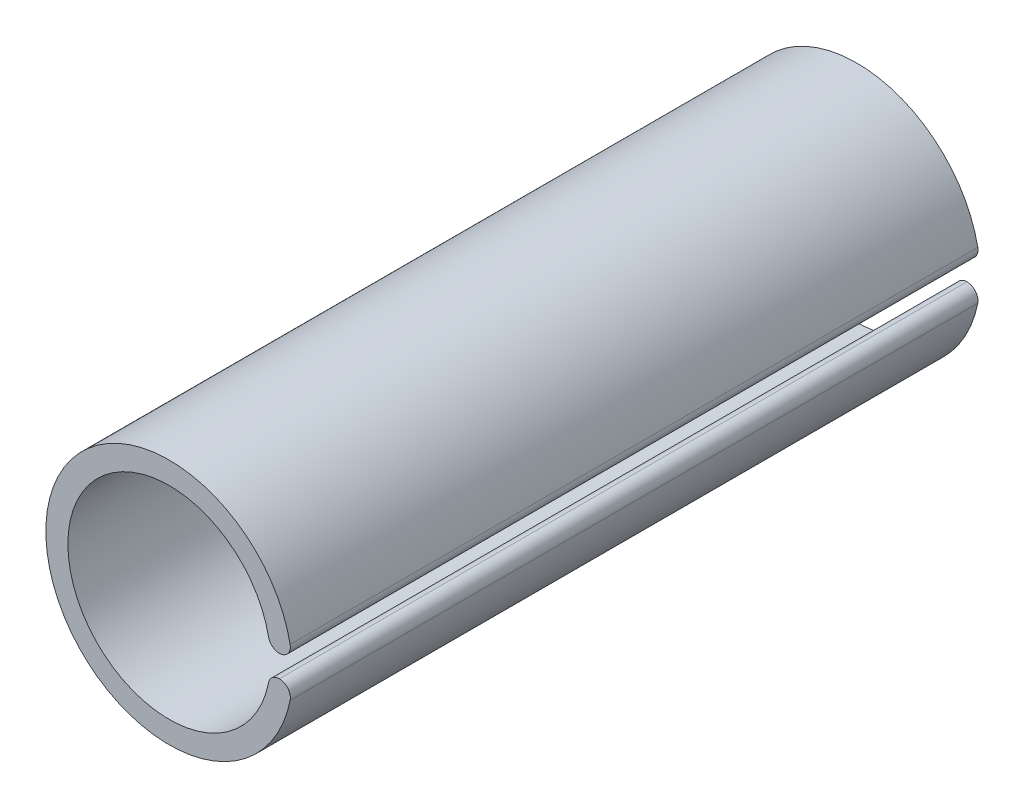
ISO-10303-21;
HEADER;
FILE_DESCRIPTION(('STEP AP214'),'2;1');
FILE_NAME('part.step','',(''),(''),'','','');
FILE_SCHEMA(('AUTOMOTIVE_DESIGN { 1 0 10303 214 1 1 1 1 }'));
ENDSEC;
DATA;
#1=APPLICATION_CONTEXT('core data for automotive mechanical design processes');
#2=APPLICATION_PROTOCOL_DEFINITION('international standard','automotive_design',2000,#1);
#3=PRODUCT_CONTEXT('',#1,'mechanical');
#4=PRODUCT('Part','Part','',(#3));
#5=PRODUCT_RELATED_PRODUCT_CATEGORY('part','',(#4));
#6=PRODUCT_DEFINITION_FORMATION('','',#4);
#7=PRODUCT_DEFINITION_CONTEXT('part definition',#1,'design');
#8=PRODUCT_DEFINITION('design','',#6,#7);
#9=PRODUCT_DEFINITION_SHAPE('','',#8);
#10=(LENGTH_UNIT() NAMED_UNIT(*) SI_UNIT(.MILLI.,.METRE.));
#11=(NAMED_UNIT(*) PLANE_ANGLE_UNIT() SI_UNIT($,.RADIAN.));
#12=(NAMED_UNIT(*) SI_UNIT($,.STERADIAN.) SOLID_ANGLE_UNIT());
#13=UNCERTAINTY_MEASURE_WITH_UNIT(LENGTH_MEASURE(1.E-05),#10,'distance_accuracy_value','');
#14=(GEOMETRIC_REPRESENTATION_CONTEXT(3) GLOBAL_UNCERTAINTY_ASSIGNED_CONTEXT((#13)) GLOBAL_UNIT_ASSIGNED_CONTEXT((#10,
#11,#12)) REPRESENTATION_CONTEXT('',''));
#15=CARTESIAN_POINT('',(0.,0.,0.));
#16=DIRECTION('',(0.,0.,1.));
#17=DIRECTION('',(1.,0.,0.));
#18=AXIS2_PLACEMENT_3D('',#15,#16,#17);
#19=CARTESIAN_POINT('',(0.,0.,31.22));
#20=DIRECTION('',(0.,0.,1.));
#21=DIRECTION('',(1.,0.,0.));
#22=AXIS2_PLACEMENT_3D('',#19,#20,#21);
#23=PLANE('',#22);
#24=CARTESIAN_POINT('',(5.00099990001999,-1.,31.22));
#25=DIRECTION('',(0.,0.,1.));
#26=DIRECTION('',(1.,0.,0.));
#27=AXIS2_PLACEMENT_3D('',#24,#25,#26);
#28=CIRCLE('',#27,0.5);
#29=CARTESIAN_POINT('',(5.49129400786509,-1.09803921568627,31.22));
#30=VERTEX_POINT('',#29);
#31=CARTESIAN_POINT('',(5.00099990001999,-0.5,31.22));
#32=VERTEX_POINT('',#31);
#33=EDGE_CURVE('E57',#30,#32,#28,.T.);
#34=ORIENTED_EDGE('',*,*,#33,.T.);
#35=CARTESIAN_POINT('',(5.00099990001999,-1.,31.22));
#36=DIRECTION('',(0.,0.,1.));
#37=DIRECTION('',(1.,0.,0.));
#38=AXIS2_PLACEMENT_3D('',#35,#36,#37);
#39=CIRCLE('',#38,0.5);
#40=CARTESIAN_POINT('',(4.5107057921749,-0.901960784313725,31.22));
#41=VERTEX_POINT('',#40);
#42=EDGE_CURVE('E102',#32,#41,#39,.T.);
#43=ORIENTED_EDGE('',*,*,#42,.T.);
#44=CARTESIAN_POINT('',(0.,0.,31.22));
#45=DIRECTION('',(0.,0.,1.));
#46=DIRECTION('',(1.,0.,0.));
#47=AXIS2_PLACEMENT_3D('',#44,#45,#46);
#48=CIRCLE('',#47,4.6);
#49=CARTESIAN_POINT('',(4.5107057921749,0.901960784313725,31.22));
#50=VERTEX_POINT('',#49);
#51=EDGE_CURVE('E92',#50,#41,#48,.T.);
#52=ORIENTED_EDGE('',*,*,#51,.F.);
#53=CARTESIAN_POINT('',(5.00099990001999,1.,31.22));
#54=DIRECTION('',(0.,0.,1.));
#55=DIRECTION('',(1.,0.,0.));
#56=AXIS2_PLACEMENT_3D('',#53,#54,#55);
#57=CIRCLE('',#56,0.5);
#58=CARTESIAN_POINT('',(5.00099990001999,0.5,31.22));
#59=VERTEX_POINT('',#58);
#60=EDGE_CURVE('E50',#50,#59,#57,.T.);
#61=ORIENTED_EDGE('',*,*,#60,.T.);
#62=CARTESIAN_POINT('',(5.00099990001999,1.,31.22));
#63=DIRECTION('',(0.,0.,1.));
#64=DIRECTION('',(1.,0.,0.));
#65=AXIS2_PLACEMENT_3D('',#62,#63,#64);
#66=CIRCLE('',#65,0.5);
#67=CARTESIAN_POINT('',(5.49129400786509,1.09803921568627,31.22));
#68=VERTEX_POINT('',#67);
#69=EDGE_CURVE('E107',#59,#68,#66,.T.);
#70=ORIENTED_EDGE('',*,*,#69,.T.);
#71=CARTESIAN_POINT('',(0.,0.,31.22));
#72=DIRECTION('',(0.,0.,1.));
#73=DIRECTION('',(1.,0.,0.));
#74=AXIS2_PLACEMENT_3D('',#71,#72,#73);
#75=CIRCLE('',#74,5.6);
#76=EDGE_CURVE('E99',#68,#30,#75,.T.);
#77=ORIENTED_EDGE('',*,*,#76,.T.);
#78=EDGE_LOOP('',(#34,#43,#52,#61,#70,#77));
#79=FACE_BOUND('',#78,.T.);
#80=ADVANCED_FACE('F33',(#79),#23,.T.);
#81=CARTESIAN_POINT('',(0.,0.,0.));
#82=DIRECTION('',(0.,0.,1.));
#83=DIRECTION('',(1.,0.,0.));
#84=AXIS2_PLACEMENT_3D('',#81,#82,#83);
#85=PLANE('',#84);
#86=CARTESIAN_POINT('',(0.,0.,0.));
#87=DIRECTION('',(0.,0.,1.));
#88=DIRECTION('',(1.,0.,0.));
#89=AXIS2_PLACEMENT_3D('',#86,#87,#88);
#90=CIRCLE('',#89,4.6);
#91=CARTESIAN_POINT('',(4.5107057921749,0.901960784313725,0.));
#92=VERTEX_POINT('',#91);
#93=CARTESIAN_POINT('',(4.5107057921749,-0.901960784313725,0.));
#94=VERTEX_POINT('',#93);
#95=EDGE_CURVE('E95',#92,#94,#90,.T.);
#96=ORIENTED_EDGE('',*,*,#95,.T.);
#97=CARTESIAN_POINT('',(5.00099990001999,-1.,0.));
#98=DIRECTION('',(0.,0.,1.));
#99=DIRECTION('',(1.,0.,0.));
#100=AXIS2_PLACEMENT_3D('',#97,#98,#99);
#101=CIRCLE('',#100,0.5);
#102=CARTESIAN_POINT('',(5.00099990001999,-0.5,0.));
#103=VERTEX_POINT('',#102);
#104=EDGE_CURVE('E108',#94,#103,#101,.F.);
#105=ORIENTED_EDGE('',*,*,#104,.T.);
#106=CARTESIAN_POINT('',(5.00099990001999,-1.,0.));
#107=DIRECTION('',(0.,0.,1.));
#108=DIRECTION('',(1.,0.,0.));
#109=AXIS2_PLACEMENT_3D('',#106,#107,#108);
#110=CIRCLE('',#109,0.5);
#111=CARTESIAN_POINT('',(5.49129400786509,-1.09803921568627,0.));
#112=VERTEX_POINT('',#111);
#113=EDGE_CURVE('E111',#103,#112,#110,.F.);
#114=ORIENTED_EDGE('',*,*,#113,.T.);
#115=CARTESIAN_POINT('',(0.,0.,0.));
#116=DIRECTION('',(0.,0.,1.));
#117=DIRECTION('',(1.,0.,0.));
#118=AXIS2_PLACEMENT_3D('',#115,#116,#117);
#119=CIRCLE('',#118,5.6);
#120=CARTESIAN_POINT('',(5.49129400786509,1.09803921568627,0.));
#121=VERTEX_POINT('',#120);
#122=EDGE_CURVE('E103',#121,#112,#119,.T.);
#123=ORIENTED_EDGE('',*,*,#122,.F.);
#124=CARTESIAN_POINT('',(5.00099990001999,1.,0.));
#125=DIRECTION('',(0.,0.,1.));
#126=DIRECTION('',(1.,0.,0.));
#127=AXIS2_PLACEMENT_3D('',#124,#125,#126);
#128=CIRCLE('',#127,0.5);
#129=CARTESIAN_POINT('',(5.00099990001999,0.5,0.));
#130=VERTEX_POINT('',#129);
#131=EDGE_CURVE('E125',#121,#130,#128,.F.);
#132=ORIENTED_EDGE('',*,*,#131,.T.);
#133=CARTESIAN_POINT('',(5.00099990001999,1.,0.));
#134=DIRECTION('',(0.,0.,1.));
#135=DIRECTION('',(1.,0.,0.));
#136=AXIS2_PLACEMENT_3D('',#133,#134,#135);
#137=CIRCLE('',#136,0.5);
#138=EDGE_CURVE('E136',#130,#92,#137,.F.);
#139=ORIENTED_EDGE('',*,*,#138,.T.);
#140=EDGE_LOOP('',(#96,#105,#114,#123,#132,#139));
#141=FACE_BOUND('',#140,.T.);
#142=ADVANCED_FACE('F140',(#141),#85,.F.);
#143=CARTESIAN_POINT('',(0.,0.,31.22));
#144=DIRECTION('',(0.,0.,-1.));
#145=DIRECTION('',(-1.,0.,0.));
#146=AXIS2_PLACEMENT_3D('',#143,#144,#145);
#147=CYLINDRICAL_SURFACE('',#146,5.6);
#148=ORIENTED_EDGE('',*,*,#122,.T.);
#149=DIRECTION('',(0.,0.,-1.));
#150=VECTOR('',#149,1.);
#151=CARTESIAN_POINT('',(5.49129400786509,-1.09803921568627,31.22));
#152=LINE('',#151,#150);
#153=EDGE_CURVE('E11',#112,#30,#152,.F.);
#154=ORIENTED_EDGE('',*,*,#153,.T.);
#155=ORIENTED_EDGE('',*,*,#76,.F.);
#156=DIRECTION('',(0.,0.,-1.));
#157=VECTOR('',#156,1.);
#158=CARTESIAN_POINT('',(5.49129400786509,1.09803921568627,31.22));
#159=LINE('',#158,#157);
#160=EDGE_CURVE('E42',#68,#121,#159,.T.);
#161=ORIENTED_EDGE('',*,*,#160,.T.);
#162=EDGE_LOOP('',(#148,#154,#155,#161));
#163=FACE_BOUND('',#162,.T.);
#164=ADVANCED_FACE('F129',(#163),#147,.T.);
#165=CARTESIAN_POINT('',(0.,0.,31.22));
#166=DIRECTION('',(0.,0.,-1.));
#167=DIRECTION('',(-1.,0.,0.));
#168=AXIS2_PLACEMENT_3D('',#165,#166,#167);
#169=CYLINDRICAL_SURFACE('',#168,4.6);
#170=ORIENTED_EDGE('',*,*,#51,.T.);
#171=DIRECTION('',(0.,0.,-1.));
#172=VECTOR('',#171,1.);
#173=CARTESIAN_POINT('',(4.5107057921749,-0.901960784313725,31.22));
#174=LINE('',#173,#172);
#175=EDGE_CURVE('E98',#41,#94,#174,.T.);
#176=ORIENTED_EDGE('',*,*,#175,.T.);
#177=ORIENTED_EDGE('',*,*,#95,.F.);
#178=DIRECTION('',(0.,0.,-1.));
#179=VECTOR('',#178,1.);
#180=CARTESIAN_POINT('',(4.5107057921749,0.901960784313725,31.22));
#181=LINE('',#180,#179);
#182=EDGE_CURVE('E89',#92,#50,#181,.F.);
#183=ORIENTED_EDGE('',*,*,#182,.T.);
#184=EDGE_LOOP('',(#170,#176,#177,#183));
#185=FACE_BOUND('',#184,.T.);
#186=ADVANCED_FACE('F90',(#185),#169,.F.);
#187=CARTESIAN_POINT('',(5.00099990001999,-1.,31.22));
#188=DIRECTION('',(0.,0.,-1.));
#189=DIRECTION('',(-1.,0.,0.));
#190=AXIS2_PLACEMENT_3D('',#187,#188,#189);
#191=CYLINDRICAL_SURFACE('',#190,0.5);
#192=DIRECTION('',(0.,0.,1.));
#193=VECTOR('',#192,1.);
#194=CARTESIAN_POINT('',(5.00099990001999,-0.5,0.));
#195=LINE('',#194,#193);
#196=EDGE_CURVE('E118',#32,#103,#195,.F.);
#197=ORIENTED_EDGE('',*,*,#196,.F.);
#198=ORIENTED_EDGE('',*,*,#33,.F.);
#199=ORIENTED_EDGE('',*,*,#153,.F.);
#200=ORIENTED_EDGE('',*,*,#113,.F.);
#201=EDGE_LOOP('',(#197,#198,#199,#200));
#202=FACE_BOUND('',#201,.T.);
#203=ADVANCED_FACE('F142',(#202),#191,.T.);
#204=CARTESIAN_POINT('',(5.00099990001999,-1.,31.22));
#205=DIRECTION('',(0.,0.,-1.));
#206=DIRECTION('',(-1.,0.,0.));
#207=AXIS2_PLACEMENT_3D('',#204,#205,#206);
#208=CYLINDRICAL_SURFACE('',#207,0.5);
#209=ORIENTED_EDGE('',*,*,#42,.F.);
#210=ORIENTED_EDGE('',*,*,#196,.T.);
#211=ORIENTED_EDGE('',*,*,#104,.F.);
#212=ORIENTED_EDGE('',*,*,#175,.F.);
#213=EDGE_LOOP('',(#209,#210,#211,#212));
#214=FACE_BOUND('',#213,.T.);
#215=ADVANCED_FACE('F143',(#214),#208,.T.);
#216=CARTESIAN_POINT('',(5.00099990001999,1.,31.22));
#217=DIRECTION('',(0.,0.,-1.));
#218=DIRECTION('',(-1.,0.,0.));
#219=AXIS2_PLACEMENT_3D('',#216,#217,#218);
#220=CYLINDRICAL_SURFACE('',#219,0.5);
#221=ORIENTED_EDGE('',*,*,#182,.F.);
#222=ORIENTED_EDGE('',*,*,#138,.F.);
#223=DIRECTION('',(0.,0.,-1.));
#224=VECTOR('',#223,1.);
#225=CARTESIAN_POINT('',(5.00099990001999,0.5,31.22));
#226=LINE('',#225,#224);
#227=EDGE_CURVE('E37',#59,#130,#226,.T.);
#228=ORIENTED_EDGE('',*,*,#227,.F.);
#229=ORIENTED_EDGE('',*,*,#60,.F.);
#230=EDGE_LOOP('',(#221,#222,#228,#229));
#231=FACE_BOUND('',#230,.T.);
#232=ADVANCED_FACE('F35',(#231),#220,.T.);
#233=CARTESIAN_POINT('',(5.00099990001999,1.,31.22));
#234=DIRECTION('',(0.,0.,-1.));
#235=DIRECTION('',(-1.,0.,0.));
#236=AXIS2_PLACEMENT_3D('',#233,#234,#235);
#237=CYLINDRICAL_SURFACE('',#236,0.5);
#238=ORIENTED_EDGE('',*,*,#131,.F.);
#239=ORIENTED_EDGE('',*,*,#160,.F.);
#240=ORIENTED_EDGE('',*,*,#69,.F.);
#241=ORIENTED_EDGE('',*,*,#227,.T.);
#242=EDGE_LOOP('',(#238,#239,#240,#241));
#243=FACE_BOUND('',#242,.T.);
#244=ADVANCED_FACE('F123',(#243),#237,.T.);
#245=CLOSED_SHELL('',(#80,#142,#164,#186,#203,#215,#232,#244));
#246=MANIFOLD_SOLID_BREP('B2',#245);
#247=ADVANCED_BREP_SHAPE_REPRESENTATION('',(#18,#246),#14);
#248=SHAPE_DEFINITION_REPRESENTATION(#9,#247);
ENDSEC;
END-ISO-10303-21;
